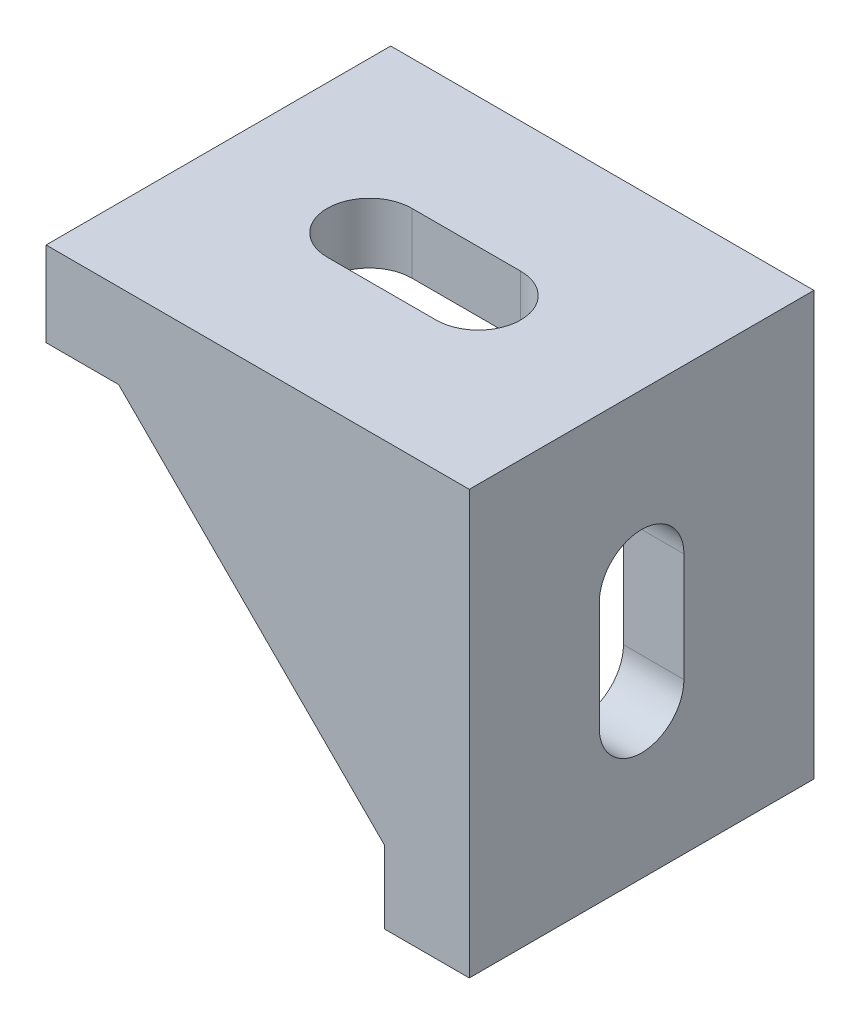
ISO-10303-21;
HEADER;
FILE_DESCRIPTION(('STEP AP214'),'2;1');
FILE_NAME('part.step','',(''),(''),'','','');
FILE_SCHEMA(('AUTOMOTIVE_DESIGN { 1 0 10303 214 1 1 1 1 }'));
ENDSEC;
DATA;
#1=APPLICATION_CONTEXT('core data for automotive mechanical design processes');
#2=APPLICATION_PROTOCOL_DEFINITION('international standard','automotive_design',2000,#1);
#3=PRODUCT_CONTEXT('',#1,'mechanical');
#4=PRODUCT('Part','Part','',(#3));
#5=PRODUCT_RELATED_PRODUCT_CATEGORY('part','',(#4));
#6=PRODUCT_DEFINITION_FORMATION('','',#4);
#7=PRODUCT_DEFINITION_CONTEXT('part definition',#1,'design');
#8=PRODUCT_DEFINITION('design','',#6,#7);
#9=PRODUCT_DEFINITION_SHAPE('','',#8);
#10=(LENGTH_UNIT() NAMED_UNIT(*) SI_UNIT(.MILLI.,.METRE.));
#11=(NAMED_UNIT(*) PLANE_ANGLE_UNIT() SI_UNIT($,.RADIAN.));
#12=(NAMED_UNIT(*) SI_UNIT($,.STERADIAN.) SOLID_ANGLE_UNIT());
#13=UNCERTAINTY_MEASURE_WITH_UNIT(LENGTH_MEASURE(1.E-05),#10,'distance_accuracy_value','');
#14=(GEOMETRIC_REPRESENTATION_CONTEXT(3) GLOBAL_UNCERTAINTY_ASSIGNED_CONTEXT((#13)) GLOBAL_UNIT_ASSIGNED_CONTEXT((#10,
#11,#12)) REPRESENTATION_CONTEXT('',''));
#15=CARTESIAN_POINT('',(0.,0.,0.));
#16=DIRECTION('',(0.,0.,1.));
#17=DIRECTION('',(1.,0.,0.));
#18=AXIS2_PLACEMENT_3D('',#15,#16,#17);
#19=CARTESIAN_POINT('',(21.8146251935267,-13.1853748064732,28.5));
#20=DIRECTION('',(0.,0.,1.));
#21=DIRECTION('',(1.,0.,0.));
#22=AXIS2_PLACEMENT_3D('',#19,#20,#21);
#23=PLANE('',#22);
#24=DIRECTION('',(-1.,0.,0.));
#25=VECTOR('',#24,1.);
#26=CARTESIAN_POINT('',(0.,0.,28.5));
#27=LINE('',#26,#25);
#28=CARTESIAN_POINT('',(35.,0.,28.5));
#29=VERTEX_POINT('',#28);
#30=CARTESIAN_POINT('',(0.,0.,28.5));
#31=VERTEX_POINT('',#30);
#32=EDGE_CURVE('E11',#29,#31,#27,.T.);
#33=ORIENTED_EDGE('',*,*,#32,.T.);
#34=DIRECTION('',(0.,-1.,0.));
#35=VECTOR('',#34,1.);
#36=CARTESIAN_POINT('',(0.,-7.,28.5));
#37=LINE('',#36,#35);
#38=CARTESIAN_POINT('',(0.,-7.,28.5));
#39=VERTEX_POINT('',#38);
#40=EDGE_CURVE('E285',#31,#39,#37,.T.);
#41=ORIENTED_EDGE('',*,*,#40,.T.);
#42=DIRECTION('',(1.,0.,0.));
#43=VECTOR('',#42,1.);
#44=CARTESIAN_POINT('',(6.,-7.,28.5));
#45=LINE('',#44,#43);
#46=CARTESIAN_POINT('',(6.,-7.,28.5));
#47=VERTEX_POINT('',#46);
#48=EDGE_CURVE('E260',#39,#47,#45,.T.);
#49=ORIENTED_EDGE('',*,*,#48,.T.);
#50=DIRECTION('',(0.707106781186547,-0.707106781186548,0.));
#51=VECTOR('',#50,1.);
#52=CARTESIAN_POINT('',(28.,-29.,28.5));
#53=LINE('',#52,#51);
#54=CARTESIAN_POINT('',(28.,-29.,28.5));
#55=VERTEX_POINT('',#54);
#56=EDGE_CURVE('E236',#47,#55,#53,.T.);
#57=ORIENTED_EDGE('',*,*,#56,.T.);
#58=DIRECTION('',(0.,-1.,0.));
#59=VECTOR('',#58,1.);
#60=CARTESIAN_POINT('',(28.,-35.,28.5));
#61=LINE('',#60,#59);
#62=CARTESIAN_POINT('',(28.,-35.,28.5));
#63=VERTEX_POINT('',#62);
#64=EDGE_CURVE('E284',#55,#63,#61,.T.);
#65=ORIENTED_EDGE('',*,*,#64,.T.);
#66=DIRECTION('',(1.,0.,0.));
#67=VECTOR('',#66,1.);
#68=CARTESIAN_POINT('',(35.,-35.,28.5));
#69=LINE('',#68,#67);
#70=CARTESIAN_POINT('',(35.,-35.,28.5));
#71=VERTEX_POINT('',#70);
#72=EDGE_CURVE('E201',#63,#71,#69,.T.);
#73=ORIENTED_EDGE('',*,*,#72,.T.);
#74=DIRECTION('',(0.,1.,0.));
#75=VECTOR('',#74,1.);
#76=CARTESIAN_POINT('',(35.,0.,28.5));
#77=LINE('',#76,#75);
#78=EDGE_CURVE('E281',#71,#29,#77,.T.);
#79=ORIENTED_EDGE('',*,*,#78,.T.);
#80=EDGE_LOOP('',(#33,#41,#49,#57,#65,#73,#79));
#81=FACE_BOUND('',#80,.T.);
#82=ADVANCED_FACE('F16',(#81),#23,.T.);
#83=CARTESIAN_POINT('',(21.8146251935267,-13.1853748064732,0.));
#84=DIRECTION('',(0.,0.,1.));
#85=DIRECTION('',(1.,0.,0.));
#86=AXIS2_PLACEMENT_3D('',#83,#84,#85);
#87=PLANE('',#86);
#88=DIRECTION('',(1.,0.,0.));
#89=VECTOR('',#88,1.);
#90=CARTESIAN_POINT('',(0.,0.,0.));
#91=LINE('',#90,#89);
#92=CARTESIAN_POINT('',(0.,0.,0.));
#93=VERTEX_POINT('',#92);
#94=CARTESIAN_POINT('',(35.,0.,0.));
#95=VERTEX_POINT('',#94);
#96=EDGE_CURVE('E26',#93,#95,#91,.T.);
#97=ORIENTED_EDGE('',*,*,#96,.T.);
#98=DIRECTION('',(0.,-1.,0.));
#99=VECTOR('',#98,1.);
#100=CARTESIAN_POINT('',(35.,0.,0.));
#101=LINE('',#100,#99);
#102=CARTESIAN_POINT('',(35.,-35.,0.));
#103=VERTEX_POINT('',#102);
#104=EDGE_CURVE('E204',#95,#103,#101,.T.);
#105=ORIENTED_EDGE('',*,*,#104,.T.);
#106=DIRECTION('',(-1.,0.,0.));
#107=VECTOR('',#106,1.);
#108=CARTESIAN_POINT('',(35.,-35.,0.));
#109=LINE('',#108,#107);
#110=CARTESIAN_POINT('',(28.,-35.,0.));
#111=VERTEX_POINT('',#110);
#112=EDGE_CURVE('E309',#103,#111,#109,.T.);
#113=ORIENTED_EDGE('',*,*,#112,.T.);
#114=DIRECTION('',(0.,1.,0.));
#115=VECTOR('',#114,1.);
#116=CARTESIAN_POINT('',(28.,-35.,0.));
#117=LINE('',#116,#115);
#118=CARTESIAN_POINT('',(28.,-29.,0.));
#119=VERTEX_POINT('',#118);
#120=EDGE_CURVE('E219',#111,#119,#117,.T.);
#121=ORIENTED_EDGE('',*,*,#120,.T.);
#122=DIRECTION('',(-0.707106781186547,0.707106781186548,0.));
#123=VECTOR('',#122,1.);
#124=CARTESIAN_POINT('',(28.,-29.,0.));
#125=LINE('',#124,#123);
#126=CARTESIAN_POINT('',(6.,-7.,0.));
#127=VERTEX_POINT('',#126);
#128=EDGE_CURVE('E158',#119,#127,#125,.T.);
#129=ORIENTED_EDGE('',*,*,#128,.T.);
#130=DIRECTION('',(-1.,0.,0.));
#131=VECTOR('',#130,1.);
#132=CARTESIAN_POINT('',(6.,-7.,0.));
#133=LINE('',#132,#131);
#134=CARTESIAN_POINT('',(0.,-7.,0.));
#135=VERTEX_POINT('',#134);
#136=EDGE_CURVE('E264',#127,#135,#133,.T.);
#137=ORIENTED_EDGE('',*,*,#136,.T.);
#138=DIRECTION('',(0.,1.,0.));
#139=VECTOR('',#138,1.);
#140=CARTESIAN_POINT('',(0.,-7.,0.));
#141=LINE('',#140,#139);
#142=EDGE_CURVE('E207',#135,#93,#141,.T.);
#143=ORIENTED_EDGE('',*,*,#142,.T.);
#144=EDGE_LOOP('',(#97,#105,#113,#121,#129,#137,#143));
#145=FACE_BOUND('',#144,.T.);
#146=ADVANCED_FACE('F326',(#145),#87,.F.);
#147=CARTESIAN_POINT('',(35.,0.,0.));
#148=DIRECTION('',(0.,1.,0.));
#149=DIRECTION('',(-1.,0.,0.));
#150=AXIS2_PLACEMENT_3D('',#147,#148,#149);
#151=PLANE('',#150);
#152=CARTESIAN_POINT('',(21.5,0.,14.25));
#153=DIRECTION('',(0.,-1.,0.));
#154=DIRECTION('',(0.,0.,-1.));
#155=AXIS2_PLACEMENT_3D('',#152,#153,#154);
#156=CIRCLE('',#155,3.5);
#157=CARTESIAN_POINT('',(21.5,0.,10.75));
#158=VERTEX_POINT('',#157);
#159=CARTESIAN_POINT('',(21.5,0.,17.75));
#160=VERTEX_POINT('',#159);
#161=EDGE_CURVE('E200',#158,#160,#156,.T.);
#162=ORIENTED_EDGE('',*,*,#161,.T.);
#163=DIRECTION('',(-1.,0.,0.));
#164=VECTOR('',#163,1.);
#165=CARTESIAN_POINT('',(23.75,0.,17.75));
#166=LINE('',#165,#164);
#167=CARTESIAN_POINT('',(12.5,0.,17.75));
#168=VERTEX_POINT('',#167);
#169=EDGE_CURVE('E245',#160,#168,#166,.T.);
#170=ORIENTED_EDGE('',*,*,#169,.T.);
#171=CARTESIAN_POINT('',(12.5,0.,14.25));
#172=DIRECTION('',(0.,-1.,0.));
#173=DIRECTION('',(0.,0.,1.));
#174=AXIS2_PLACEMENT_3D('',#171,#172,#173);
#175=CIRCLE('',#174,3.5);
#176=CARTESIAN_POINT('',(12.5,0.,10.75));
#177=VERTEX_POINT('',#176);
#178=EDGE_CURVE('E289',#168,#177,#175,.T.);
#179=ORIENTED_EDGE('',*,*,#178,.T.);
#180=DIRECTION('',(1.,0.,0.));
#181=VECTOR('',#180,1.);
#182=CARTESIAN_POINT('',(28.25,0.,10.75));
#183=LINE('',#182,#181);
#184=EDGE_CURVE('E194',#177,#158,#183,.T.);
#185=ORIENTED_EDGE('',*,*,#184,.T.);
#186=EDGE_LOOP('',(#162,#170,#179,#185));
#187=FACE_BOUND('',#186,.T.);
#188=ORIENTED_EDGE('',*,*,#96,.F.);
#189=DIRECTION('',(0.,0.,1.));
#190=VECTOR('',#189,1.);
#191=CARTESIAN_POINT('',(0.,0.,0.));
#192=LINE('',#191,#190);
#193=EDGE_CURVE('E221',#93,#31,#192,.T.);
#194=ORIENTED_EDGE('',*,*,#193,.T.);
#195=ORIENTED_EDGE('',*,*,#32,.F.);
#196=DIRECTION('',(0.,0.,1.));
#197=VECTOR('',#196,1.);
#198=CARTESIAN_POINT('',(35.,0.,0.));
#199=LINE('',#198,#197);
#200=EDGE_CURVE('E278',#95,#29,#199,.T.);
#201=ORIENTED_EDGE('',*,*,#200,.F.);
#202=EDGE_LOOP('',(#188,#194,#195,#201));
#203=FACE_BOUND('',#202,.T.);
#204=ADVANCED_FACE('F374',(#187,#203),#151,.T.);
#205=CARTESIAN_POINT('',(0.,0.,0.));
#206=DIRECTION('',(-1.,0.,0.));
#207=DIRECTION('',(0.,-1.,0.));
#208=AXIS2_PLACEMENT_3D('',#205,#206,#207);
#209=PLANE('',#208);
#210=DIRECTION('',(0.,-1.,0.));
#211=VECTOR('',#210,1.);
#212=CARTESIAN_POINT('',(0.,-17.5,25.5));
#213=LINE('',#212,#211);
#214=CARTESIAN_POINT('',(0.,-5.,25.5));
#215=VERTEX_POINT('',#214);
#216=CARTESIAN_POINT('',(0.,-7.,25.5));
#217=VERTEX_POINT('',#216);
#218=EDGE_CURVE('E240',#215,#217,#213,.T.);
#219=ORIENTED_EDGE('',*,*,#218,.T.);
#220=DIRECTION('',(0.,0.,1.));
#221=VECTOR('',#220,1.);
#222=CARTESIAN_POINT('',(0.,-7.,0.));
#223=LINE('',#222,#221);
#224=EDGE_CURVE('E269',#217,#39,#223,.T.);
#225=ORIENTED_EDGE('',*,*,#224,.T.);
#226=ORIENTED_EDGE('',*,*,#40,.F.);
#227=ORIENTED_EDGE('',*,*,#193,.F.);
#228=ORIENTED_EDGE('',*,*,#142,.F.);
#229=DIRECTION('',(0.,0.,1.));
#230=VECTOR('',#229,1.);
#231=CARTESIAN_POINT('',(0.,-7.,0.));
#232=LINE('',#231,#230);
#233=CARTESIAN_POINT('',(0.,-7.,3.));
#234=VERTEX_POINT('',#233);
#235=EDGE_CURVE('E247',#135,#234,#232,.T.);
#236=ORIENTED_EDGE('',*,*,#235,.T.);
#237=DIRECTION('',(0.,1.,0.));
#238=VECTOR('',#237,1.);
#239=CARTESIAN_POINT('',(0.,-17.5,3.));
#240=LINE('',#239,#238);
#241=CARTESIAN_POINT('',(0.,-5.,3.));
#242=VERTEX_POINT('',#241);
#243=EDGE_CURVE('E300',#234,#242,#240,.T.);
#244=ORIENTED_EDGE('',*,*,#243,.T.);
#245=DIRECTION('',(0.,0.,1.));
#246=VECTOR('',#245,1.);
#247=CARTESIAN_POINT('',(0.,-5.,7.125));
#248=LINE('',#247,#246);
#249=EDGE_CURVE('E136',#242,#215,#248,.T.);
#250=ORIENTED_EDGE('',*,*,#249,.T.);
#251=EDGE_LOOP('',(#219,#225,#226,#227,#228,#236,#244,#250));
#252=FACE_BOUND('',#251,.T.);
#253=ADVANCED_FACE('F337',(#252),#209,.T.);
#254=CARTESIAN_POINT('',(35.,-35.,0.));
#255=DIRECTION('',(1.,0.,0.));
#256=DIRECTION('',(0.,1.,0.));
#257=AXIS2_PLACEMENT_3D('',#254,#255,#256);
#258=PLANE('',#257);
#259=CARTESIAN_POINT('',(35.,-13.5,14.25));
#260=DIRECTION('',(-1.,0.,0.));
#261=DIRECTION('',(0.,0.,-1.));
#262=AXIS2_PLACEMENT_3D('',#259,#260,#261);
#263=CIRCLE('',#262,3.5);
#264=CARTESIAN_POINT('',(35.,-13.5,17.75));
#265=VERTEX_POINT('',#264);
#266=CARTESIAN_POINT('',(35.,-13.5,10.75));
#267=VERTEX_POINT('',#266);
#268=EDGE_CURVE('E181',#265,#267,#263,.T.);
#269=ORIENTED_EDGE('',*,*,#268,.T.);
#270=DIRECTION('',(0.,-1.,0.));
#271=VECTOR('',#270,1.);
#272=CARTESIAN_POINT('',(35.,-28.75,10.75));
#273=LINE('',#272,#271);
#274=CARTESIAN_POINT('',(35.,-22.5,10.75));
#275=VERTEX_POINT('',#274);
#276=EDGE_CURVE('E227',#267,#275,#273,.T.);
#277=ORIENTED_EDGE('',*,*,#276,.T.);
#278=CARTESIAN_POINT('',(35.,-22.5,14.25));
#279=DIRECTION('',(-1.,0.,0.));
#280=DIRECTION('',(0.,0.,1.));
#281=AXIS2_PLACEMENT_3D('',#278,#279,#280);
#282=CIRCLE('',#281,3.5);
#283=CARTESIAN_POINT('',(35.,-22.5,17.75));
#284=VERTEX_POINT('',#283);
#285=EDGE_CURVE('E214',#275,#284,#282,.T.);
#286=ORIENTED_EDGE('',*,*,#285,.T.);
#287=DIRECTION('',(0.,1.,0.));
#288=VECTOR('',#287,1.);
#289=CARTESIAN_POINT('',(35.,-24.25,17.75));
#290=LINE('',#289,#288);
#291=EDGE_CURVE('E211',#284,#265,#290,.T.);
#292=ORIENTED_EDGE('',*,*,#291,.T.);
#293=EDGE_LOOP('',(#269,#277,#286,#292));
#294=FACE_BOUND('',#293,.T.);
#295=ORIENTED_EDGE('',*,*,#104,.F.);
#296=ORIENTED_EDGE('',*,*,#200,.T.);
#297=ORIENTED_EDGE('',*,*,#78,.F.);
#298=DIRECTION('',(0.,0.,1.));
#299=VECTOR('',#298,1.);
#300=CARTESIAN_POINT('',(35.,-35.,0.));
#301=LINE('',#300,#299);
#302=EDGE_CURVE('E205',#103,#71,#301,.T.);
#303=ORIENTED_EDGE('',*,*,#302,.F.);
#304=EDGE_LOOP('',(#295,#296,#297,#303));
#305=FACE_BOUND('',#304,.T.);
#306=ADVANCED_FACE('F373',(#294,#305),#258,.T.);
#307=CARTESIAN_POINT('',(28.,-35.,0.));
#308=DIRECTION('',(0.,-1.,0.));
#309=DIRECTION('',(1.,0.,0.));
#310=AXIS2_PLACEMENT_3D('',#307,#308,#309);
#311=PLANE('',#310);
#312=DIRECTION('',(1.,0.,0.));
#313=VECTOR('',#312,1.);
#314=CARTESIAN_POINT('',(14.,-35.,25.5));
#315=LINE('',#314,#313);
#316=CARTESIAN_POINT('',(28.,-35.,25.5));
#317=VERTEX_POINT('',#316);
#318=CARTESIAN_POINT('',(30.,-35.,25.5));
#319=VERTEX_POINT('',#318);
#320=EDGE_CURVE('E253',#317,#319,#315,.T.);
#321=ORIENTED_EDGE('',*,*,#320,.T.);
#322=DIRECTION('',(0.,0.,-1.));
#323=VECTOR('',#322,1.);
#324=CARTESIAN_POINT('',(30.,-35.,12.75));
#325=LINE('',#324,#323);
#326=CARTESIAN_POINT('',(30.,-35.,3.));
#327=VERTEX_POINT('',#326);
#328=EDGE_CURVE('E297',#319,#327,#325,.T.);
#329=ORIENTED_EDGE('',*,*,#328,.T.);
#330=DIRECTION('',(-1.,0.,0.));
#331=VECTOR('',#330,1.);
#332=CARTESIAN_POINT('',(29.,-35.,3.));
#333=LINE('',#332,#331);
#334=CARTESIAN_POINT('',(28.,-35.,3.));
#335=VERTEX_POINT('',#334);
#336=EDGE_CURVE('E171',#327,#335,#333,.T.);
#337=ORIENTED_EDGE('',*,*,#336,.T.);
#338=DIRECTION('',(0.,0.,1.));
#339=VECTOR('',#338,1.);
#340=CARTESIAN_POINT('',(28.,-35.,0.));
#341=LINE('',#340,#339);
#342=EDGE_CURVE('E167',#111,#335,#341,.T.);
#343=ORIENTED_EDGE('',*,*,#342,.F.);
#344=ORIENTED_EDGE('',*,*,#112,.F.);
#345=ORIENTED_EDGE('',*,*,#302,.T.);
#346=ORIENTED_EDGE('',*,*,#72,.F.);
#347=DIRECTION('',(0.,0.,1.));
#348=VECTOR('',#347,1.);
#349=CARTESIAN_POINT('',(28.,-35.,0.));
#350=LINE('',#349,#348);
#351=EDGE_CURVE('E218',#317,#63,#350,.T.);
#352=ORIENTED_EDGE('',*,*,#351,.F.);
#353=EDGE_LOOP('',(#321,#329,#337,#343,#344,#345,#346,#352));
#354=FACE_BOUND('',#353,.T.);
#355=ADVANCED_FACE('F330',(#354),#311,.T.);
#356=CARTESIAN_POINT('',(28.,-29.,0.));
#357=DIRECTION('',(-1.,0.,0.));
#358=DIRECTION('',(0.,-1.,0.));
#359=AXIS2_PLACEMENT_3D('',#356,#357,#358);
#360=PLANE('',#359);
#361=DIRECTION('',(0.,-1.,0.));
#362=VECTOR('',#361,1.);
#363=CARTESIAN_POINT('',(28.,-32.,25.5));
#364=LINE('',#363,#362);
#365=CARTESIAN_POINT('',(28.,-29.,25.5));
#366=VERTEX_POINT('',#365);
#367=EDGE_CURVE('E250',#366,#317,#364,.T.);
#368=ORIENTED_EDGE('',*,*,#367,.T.);
#369=ORIENTED_EDGE('',*,*,#351,.T.);
#370=ORIENTED_EDGE('',*,*,#64,.F.);
#371=DIRECTION('',(0.,0.,1.));
#372=VECTOR('',#371,1.);
#373=CARTESIAN_POINT('',(28.,-29.,0.));
#374=LINE('',#373,#372);
#375=EDGE_CURVE('E161',#366,#55,#374,.T.);
#376=ORIENTED_EDGE('',*,*,#375,.F.);
#377=EDGE_LOOP('',(#368,#369,#370,#376));
#378=FACE_BOUND('',#377,.T.);
#379=ADVANCED_FACE('F368',(#378),#360,.T.);
#380=CARTESIAN_POINT('',(28.,-29.,0.));
#381=DIRECTION('',(-1.,0.,0.));
#382=DIRECTION('',(0.,-1.,0.));
#383=AXIS2_PLACEMENT_3D('',#380,#381,#382);
#384=PLANE('',#383);
#385=DIRECTION('',(0.,1.,0.));
#386=VECTOR('',#385,1.);
#387=CARTESIAN_POINT('',(28.,-32.,3.));
#388=LINE('',#387,#386);
#389=CARTESIAN_POINT('',(28.,-29.,3.));
#390=VERTEX_POINT('',#389);
#391=EDGE_CURVE('E164',#335,#390,#388,.T.);
#392=ORIENTED_EDGE('',*,*,#391,.T.);
#393=DIRECTION('',(0.,0.,1.));
#394=VECTOR('',#393,1.);
#395=CARTESIAN_POINT('',(28.,-29.,0.));
#396=LINE('',#395,#394);
#397=EDGE_CURVE('E151',#119,#390,#396,.T.);
#398=ORIENTED_EDGE('',*,*,#397,.F.);
#399=ORIENTED_EDGE('',*,*,#120,.F.);
#400=ORIENTED_EDGE('',*,*,#342,.T.);
#401=EDGE_LOOP('',(#392,#398,#399,#400));
#402=FACE_BOUND('',#401,.T.);
#403=ADVANCED_FACE('F165',(#402),#384,.T.);
#404=CARTESIAN_POINT('',(6.,-7.,0.));
#405=DIRECTION('',(-0.707106781186548,-0.707106781186547,0.));
#406=DIRECTION('',(0.707106781186547,-0.707106781186548,0.));
#407=AXIS2_PLACEMENT_3D('',#404,#405,#406);
#408=PLANE('',#407);
#409=DIRECTION('',(0.707106781186547,-0.707106781186548,0.));
#410=VECTOR('',#409,1.);
#411=CARTESIAN_POINT('',(11.5,-12.5,25.5));
#412=LINE('',#411,#410);
#413=CARTESIAN_POINT('',(6.,-7.,25.5));
#414=VERTEX_POINT('',#413);
#415=EDGE_CURVE('E177',#414,#366,#412,.T.);
#416=ORIENTED_EDGE('',*,*,#415,.T.);
#417=ORIENTED_EDGE('',*,*,#375,.T.);
#418=ORIENTED_EDGE('',*,*,#56,.F.);
#419=DIRECTION('',(0.,0.,1.));
#420=VECTOR('',#419,1.);
#421=CARTESIAN_POINT('',(6.,-7.,0.));
#422=LINE('',#421,#420);
#423=EDGE_CURVE('E257',#414,#47,#422,.T.);
#424=ORIENTED_EDGE('',*,*,#423,.F.);
#425=EDGE_LOOP('',(#416,#417,#418,#424));
#426=FACE_BOUND('',#425,.T.);
#427=ADVANCED_FACE('F355',(#426),#408,.T.);
#428=CARTESIAN_POINT('',(6.,-7.,0.));
#429=DIRECTION('',(-0.707106781186548,-0.707106781186547,0.));
#430=DIRECTION('',(0.707106781186547,-0.707106781186548,0.));
#431=AXIS2_PLACEMENT_3D('',#428,#429,#430);
#432=PLANE('',#431);
#433=DIRECTION('',(-0.707106781186547,0.707106781186548,0.));
#434=VECTOR('',#433,1.);
#435=CARTESIAN_POINT('',(19.,-20.,3.));
#436=LINE('',#435,#434);
#437=CARTESIAN_POINT('',(6.,-7.,3.));
#438=VERTEX_POINT('',#437);
#439=EDGE_CURVE('E156',#390,#438,#436,.T.);
#440=ORIENTED_EDGE('',*,*,#439,.T.);
#441=DIRECTION('',(0.,0.,1.));
#442=VECTOR('',#441,1.);
#443=CARTESIAN_POINT('',(6.,-7.,0.));
#444=LINE('',#443,#442);
#445=EDGE_CURVE('E261',#127,#438,#444,.T.);
#446=ORIENTED_EDGE('',*,*,#445,.F.);
#447=ORIENTED_EDGE('',*,*,#128,.F.);
#448=ORIENTED_EDGE('',*,*,#397,.T.);
#449=EDGE_LOOP('',(#440,#446,#447,#448));
#450=FACE_BOUND('',#449,.T.);
#451=ADVANCED_FACE('F153',(#450),#432,.T.);
#452=CARTESIAN_POINT('',(0.,-7.,0.));
#453=DIRECTION('',(0.,-1.,0.));
#454=DIRECTION('',(1.,0.,0.));
#455=AXIS2_PLACEMENT_3D('',#452,#453,#454);
#456=PLANE('',#455);
#457=DIRECTION('',(1.,0.,0.));
#458=VECTOR('',#457,1.);
#459=CARTESIAN_POINT('',(0.,-7.,25.5));
#460=LINE('',#459,#458);
#461=EDGE_CURVE('E237',#217,#414,#460,.T.);
#462=ORIENTED_EDGE('',*,*,#461,.T.);
#463=ORIENTED_EDGE('',*,*,#423,.T.);
#464=ORIENTED_EDGE('',*,*,#48,.F.);
#465=ORIENTED_EDGE('',*,*,#224,.F.);
#466=EDGE_LOOP('',(#462,#463,#464,#465));
#467=FACE_BOUND('',#466,.T.);
#468=ADVANCED_FACE('F361',(#467),#456,.T.);
#469=CARTESIAN_POINT('',(0.,-7.,0.));
#470=DIRECTION('',(0.,-1.,0.));
#471=DIRECTION('',(1.,0.,0.));
#472=AXIS2_PLACEMENT_3D('',#469,#470,#471);
#473=PLANE('',#472);
#474=DIRECTION('',(-1.,0.,0.));
#475=VECTOR('',#474,1.);
#476=CARTESIAN_POINT('',(15.,-7.,3.));
#477=LINE('',#476,#475);
#478=EDGE_CURVE('E20',#438,#234,#477,.T.);
#479=ORIENTED_EDGE('',*,*,#478,.T.);
#480=ORIENTED_EDGE('',*,*,#235,.F.);
#481=ORIENTED_EDGE('',*,*,#136,.F.);
#482=ORIENTED_EDGE('',*,*,#445,.T.);
#483=EDGE_LOOP('',(#479,#480,#481,#482));
#484=FACE_BOUND('',#483,.T.);
#485=ADVANCED_FACE('F340',(#484),#473,.T.);
#486=CARTESIAN_POINT('',(15.,-5.,14.25));
#487=DIRECTION('',(0.,1.,0.));
#488=DIRECTION('',(0.,0.,1.));
#489=AXIS2_PLACEMENT_3D('',#486,#487,#488);
#490=PLANE('',#489);
#491=CARTESIAN_POINT('',(21.5,-5.,14.25));
#492=DIRECTION('',(0.,1.,0.));
#493=DIRECTION('',(0.,0.,-1.));
#494=AXIS2_PLACEMENT_3D('',#491,#492,#493);
#495=CIRCLE('',#494,3.5);
#496=CARTESIAN_POINT('',(21.5,-5.,17.75));
#497=VERTEX_POINT('',#496);
#498=CARTESIAN_POINT('',(21.5,-5.,10.75));
#499=VERTEX_POINT('',#498);
#500=EDGE_CURVE('E196',#497,#499,#495,.T.);
#501=ORIENTED_EDGE('',*,*,#500,.T.);
#502=DIRECTION('',(-1.,0.,0.));
#503=VECTOR('',#502,1.);
#504=CARTESIAN_POINT('',(18.25,-5.,10.75));
#505=LINE('',#504,#503);
#506=CARTESIAN_POINT('',(12.5,-5.,10.75));
#507=VERTEX_POINT('',#506);
#508=EDGE_CURVE('E224',#499,#507,#505,.T.);
#509=ORIENTED_EDGE('',*,*,#508,.T.);
#510=CARTESIAN_POINT('',(12.5,-5.,14.25));
#511=DIRECTION('',(0.,1.,0.));
#512=DIRECTION('',(0.,0.,1.));
#513=AXIS2_PLACEMENT_3D('',#510,#511,#512);
#514=CIRCLE('',#513,3.5);
#515=CARTESIAN_POINT('',(12.5,-5.,17.75));
#516=VERTEX_POINT('',#515);
#517=EDGE_CURVE('E195',#507,#516,#514,.T.);
#518=ORIENTED_EDGE('',*,*,#517,.T.);
#519=DIRECTION('',(1.,0.,0.));
#520=VECTOR('',#519,1.);
#521=CARTESIAN_POINT('',(13.75,-5.,17.75));
#522=LINE('',#521,#520);
#523=EDGE_CURVE('E241',#516,#497,#522,.T.);
#524=ORIENTED_EDGE('',*,*,#523,.T.);
#525=EDGE_LOOP('',(#501,#509,#518,#524));
#526=FACE_BOUND('',#525,.T.);
#527=DIRECTION('',(1.,0.,0.));
#528=VECTOR('',#527,1.);
#529=CARTESIAN_POINT('',(0.,-5.,25.5));
#530=LINE('',#529,#528);
#531=CARTESIAN_POINT('',(30.,-5.,25.5));
#532=VERTEX_POINT('',#531);
#533=EDGE_CURVE('E243',#215,#532,#530,.T.);
#534=ORIENTED_EDGE('',*,*,#533,.F.);
#535=ORIENTED_EDGE('',*,*,#249,.F.);
#536=DIRECTION('',(-1.,0.,0.));
#537=VECTOR('',#536,1.);
#538=CARTESIAN_POINT('',(30.,-5.,3.));
#539=LINE('',#538,#537);
#540=CARTESIAN_POINT('',(30.,-5.,3.));
#541=VERTEX_POINT('',#540);
#542=EDGE_CURVE('E234',#541,#242,#539,.T.);
#543=ORIENTED_EDGE('',*,*,#542,.F.);
#544=DIRECTION('',(0.,0.,-1.));
#545=VECTOR('',#544,1.);
#546=CARTESIAN_POINT('',(30.,-5.,25.5));
#547=LINE('',#546,#545);
#548=EDGE_CURVE('E142',#532,#541,#547,.T.);
#549=ORIENTED_EDGE('',*,*,#548,.F.);
#550=EDGE_LOOP('',(#534,#535,#543,#549));
#551=FACE_BOUND('',#550,.T.);
#552=ADVANCED_FACE('F335',(#526,#551),#490,.F.);
#553=CARTESIAN_POINT('',(30.,-35.,25.5));
#554=DIRECTION('',(1.,0.,0.));
#555=DIRECTION('',(0.,0.,-1.));
#556=AXIS2_PLACEMENT_3D('',#553,#554,#555);
#557=PLANE('',#556);
#558=CARTESIAN_POINT('',(30.,-13.5,14.25));
#559=DIRECTION('',(1.,0.,0.));
#560=DIRECTION('',(0.,0.,-1.));
#561=AXIS2_PLACEMENT_3D('',#558,#559,#560);
#562=CIRCLE('',#561,3.5);
#563=CARTESIAN_POINT('',(30.,-13.5,10.75));
#564=VERTEX_POINT('',#563);
#565=CARTESIAN_POINT('',(30.,-13.5,17.75));
#566=VERTEX_POINT('',#565);
#567=EDGE_CURVE('E184',#564,#566,#562,.T.);
#568=ORIENTED_EDGE('',*,*,#567,.T.);
#569=DIRECTION('',(0.,-1.,0.));
#570=VECTOR('',#569,1.);
#571=CARTESIAN_POINT('',(30.,-24.25,17.75));
#572=LINE('',#571,#570);
#573=CARTESIAN_POINT('',(30.,-22.5,17.75));
#574=VERTEX_POINT('',#573);
#575=EDGE_CURVE('E208',#566,#574,#572,.T.);
#576=ORIENTED_EDGE('',*,*,#575,.T.);
#577=CARTESIAN_POINT('',(30.,-22.5,14.25));
#578=DIRECTION('',(1.,0.,0.));
#579=DIRECTION('',(0.,0.,1.));
#580=AXIS2_PLACEMENT_3D('',#577,#578,#579);
#581=CIRCLE('',#580,3.5);
#582=CARTESIAN_POINT('',(30.,-22.5,10.75));
#583=VERTEX_POINT('',#582);
#584=EDGE_CURVE('E186',#574,#583,#581,.T.);
#585=ORIENTED_EDGE('',*,*,#584,.T.);
#586=DIRECTION('',(0.,1.,0.));
#587=VECTOR('',#586,1.);
#588=CARTESIAN_POINT('',(30.,-28.75,10.75));
#589=LINE('',#588,#587);
#590=EDGE_CURVE('E230',#583,#564,#589,.T.);
#591=ORIENTED_EDGE('',*,*,#590,.T.);
#592=EDGE_LOOP('',(#568,#576,#585,#591));
#593=FACE_BOUND('',#592,.T.);
#594=ORIENTED_EDGE('',*,*,#328,.F.);
#595=DIRECTION('',(0.,1.,0.));
#596=VECTOR('',#595,1.);
#597=CARTESIAN_POINT('',(30.,-35.,25.5));
#598=LINE('',#597,#596);
#599=EDGE_CURVE('E256',#319,#532,#598,.T.);
#600=ORIENTED_EDGE('',*,*,#599,.T.);
#601=ORIENTED_EDGE('',*,*,#548,.T.);
#602=DIRECTION('',(0.,1.,0.));
#603=VECTOR('',#602,1.);
#604=CARTESIAN_POINT('',(30.,-35.,3.));
#605=LINE('',#604,#603);
#606=EDGE_CURVE('E231',#327,#541,#605,.T.);
#607=ORIENTED_EDGE('',*,*,#606,.F.);
#608=EDGE_LOOP('',(#594,#600,#601,#607));
#609=FACE_BOUND('',#608,.T.);
#610=ADVANCED_FACE('F333',(#593,#609),#557,.F.);
#611=CARTESIAN_POINT('',(30.,-35.,3.));
#612=DIRECTION('',(0.,0.,-1.));
#613=DIRECTION('',(-1.,0.,0.));
#614=AXIS2_PLACEMENT_3D('',#611,#612,#613);
#615=PLANE('',#614);
#616=ORIENTED_EDGE('',*,*,#478,.F.);
#617=ORIENTED_EDGE('',*,*,#439,.F.);
#618=ORIENTED_EDGE('',*,*,#391,.F.);
#619=ORIENTED_EDGE('',*,*,#336,.F.);
#620=ORIENTED_EDGE('',*,*,#606,.T.);
#621=ORIENTED_EDGE('',*,*,#542,.T.);
#622=ORIENTED_EDGE('',*,*,#243,.F.);
#623=EDGE_LOOP('',(#616,#617,#618,#619,#620,#621,#622));
#624=FACE_BOUND('',#623,.T.);
#625=ADVANCED_FACE('F173',(#624),#615,.F.);
#626=CARTESIAN_POINT('',(0.,-35.,25.5));
#627=DIRECTION('',(0.,0.,1.));
#628=DIRECTION('',(1.,0.,0.));
#629=AXIS2_PLACEMENT_3D('',#626,#627,#628);
#630=PLANE('',#629);
#631=ORIENTED_EDGE('',*,*,#461,.F.);
#632=ORIENTED_EDGE('',*,*,#218,.F.);
#633=ORIENTED_EDGE('',*,*,#533,.T.);
#634=ORIENTED_EDGE('',*,*,#599,.F.);
#635=ORIENTED_EDGE('',*,*,#320,.F.);
#636=ORIENTED_EDGE('',*,*,#367,.F.);
#637=ORIENTED_EDGE('',*,*,#415,.F.);
#638=EDGE_LOOP('',(#631,#632,#633,#634,#635,#636,#637));
#639=FACE_BOUND('',#638,.T.);
#640=ADVANCED_FACE('F364',(#639),#630,.F.);
#641=CARTESIAN_POINT('',(12.5,-5.,17.75));
#642=DIRECTION('',(0.,0.,1.));
#643=DIRECTION('',(1.,0.,0.));
#644=AXIS2_PLACEMENT_3D('',#641,#642,#643);
#645=PLANE('',#644);
#646=ORIENTED_EDGE('',*,*,#169,.F.);
#647=DIRECTION('',(0.,1.,0.));
#648=VECTOR('',#647,1.);
#649=CARTESIAN_POINT('',(21.5,-5.,17.75));
#650=LINE('',#649,#648);
#651=EDGE_CURVE('E199',#497,#160,#650,.T.);
#652=ORIENTED_EDGE('',*,*,#651,.F.);
#653=ORIENTED_EDGE('',*,*,#523,.F.);
#654=DIRECTION('',(0.,1.,0.));
#655=VECTOR('',#654,1.);
#656=CARTESIAN_POINT('',(12.5,-5.,17.75));
#657=LINE('',#656,#655);
#658=EDGE_CURVE('E304',#516,#168,#657,.T.);
#659=ORIENTED_EDGE('',*,*,#658,.T.);
#660=EDGE_LOOP('',(#646,#652,#653,#659));
#661=FACE_BOUND('',#660,.T.);
#662=ADVANCED_FACE('F386',(#661),#645,.F.);
#663=CARTESIAN_POINT('',(21.5,-5.,14.25));
#664=DIRECTION('',(0.,-1.,0.));
#665=DIRECTION('',(0.,0.,-1.));
#666=AXIS2_PLACEMENT_3D('',#663,#664,#665);
#667=CYLINDRICAL_SURFACE('',#666,3.5);
#668=ORIENTED_EDGE('',*,*,#161,.F.);
#669=DIRECTION('',(0.,1.,0.));
#670=VECTOR('',#669,1.);
#671=CARTESIAN_POINT('',(21.5,-5.,10.75));
#672=LINE('',#671,#670);
#673=EDGE_CURVE('E226',#499,#158,#672,.T.);
#674=ORIENTED_EDGE('',*,*,#673,.F.);
#675=ORIENTED_EDGE('',*,*,#500,.F.);
#676=ORIENTED_EDGE('',*,*,#651,.T.);
#677=EDGE_LOOP('',(#668,#674,#675,#676));
#678=FACE_BOUND('',#677,.T.);
#679=ADVANCED_FACE('F397',(#678),#667,.F.);
#680=CARTESIAN_POINT('',(21.5,-5.,10.75));
#681=DIRECTION('',(0.,0.,-1.));
#682=DIRECTION('',(-1.,0.,0.));
#683=AXIS2_PLACEMENT_3D('',#680,#681,#682);
#684=PLANE('',#683);
#685=ORIENTED_EDGE('',*,*,#184,.F.);
#686=DIRECTION('',(0.,1.,0.));
#687=VECTOR('',#686,1.);
#688=CARTESIAN_POINT('',(12.5,-5.,10.75));
#689=LINE('',#688,#687);
#690=EDGE_CURVE('E191',#507,#177,#689,.T.);
#691=ORIENTED_EDGE('',*,*,#690,.F.);
#692=ORIENTED_EDGE('',*,*,#508,.F.);
#693=ORIENTED_EDGE('',*,*,#673,.T.);
#694=EDGE_LOOP('',(#685,#691,#692,#693));
#695=FACE_BOUND('',#694,.T.);
#696=ADVANCED_FACE('F393',(#695),#684,.F.);
#697=CARTESIAN_POINT('',(12.5,-5.,14.25));
#698=DIRECTION('',(0.,-1.,0.));
#699=DIRECTION('',(0.,0.,1.));
#700=AXIS2_PLACEMENT_3D('',#697,#698,#699);
#701=CYLINDRICAL_SURFACE('',#700,3.5);
#702=ORIENTED_EDGE('',*,*,#178,.F.);
#703=ORIENTED_EDGE('',*,*,#658,.F.);
#704=ORIENTED_EDGE('',*,*,#517,.F.);
#705=ORIENTED_EDGE('',*,*,#690,.T.);
#706=EDGE_LOOP('',(#702,#703,#704,#705));
#707=FACE_BOUND('',#706,.T.);
#708=ADVANCED_FACE('F389',(#707),#701,.F.);
#709=CARTESIAN_POINT('',(30.,-22.5,10.75));
#710=DIRECTION('',(0.,0.,-1.));
#711=DIRECTION('',(0.,1.,0.));
#712=AXIS2_PLACEMENT_3D('',#709,#710,#711);
#713=PLANE('',#712);
#714=ORIENTED_EDGE('',*,*,#276,.F.);
#715=DIRECTION('',(1.,0.,0.));
#716=VECTOR('',#715,1.);
#717=CARTESIAN_POINT('',(30.,-13.5,10.75));
#718=LINE('',#717,#716);
#719=EDGE_CURVE('E223',#564,#267,#718,.T.);
#720=ORIENTED_EDGE('',*,*,#719,.F.);
#721=ORIENTED_EDGE('',*,*,#590,.F.);
#722=DIRECTION('',(1.,0.,0.));
#723=VECTOR('',#722,1.);
#724=CARTESIAN_POINT('',(30.,-22.5,10.75));
#725=LINE('',#724,#723);
#726=EDGE_CURVE('E190',#583,#275,#725,.T.);
#727=ORIENTED_EDGE('',*,*,#726,.T.);
#728=EDGE_LOOP('',(#714,#720,#721,#727));
#729=FACE_BOUND('',#728,.T.);
#730=ADVANCED_FACE('F405',(#729),#713,.F.);
#731=CARTESIAN_POINT('',(30.,-13.5,14.25));
#732=DIRECTION('',(-1.,0.,0.));
#733=DIRECTION('',(0.,0.,-1.));
#734=AXIS2_PLACEMENT_3D('',#731,#732,#733);
#735=CYLINDRICAL_SURFACE('',#734,3.5);
#736=ORIENTED_EDGE('',*,*,#268,.F.);
#737=DIRECTION('',(1.,0.,0.));
#738=VECTOR('',#737,1.);
#739=CARTESIAN_POINT('',(30.,-13.5,17.75));
#740=LINE('',#739,#738);
#741=EDGE_CURVE('E185',#566,#265,#740,.T.);
#742=ORIENTED_EDGE('',*,*,#741,.F.);
#743=ORIENTED_EDGE('',*,*,#567,.F.);
#744=ORIENTED_EDGE('',*,*,#719,.T.);
#745=EDGE_LOOP('',(#736,#742,#743,#744));
#746=FACE_BOUND('',#745,.T.);
#747=ADVANCED_FACE('F411',(#746),#735,.F.);
#748=CARTESIAN_POINT('',(30.,-13.5,17.75));
#749=DIRECTION('',(0.,0.,1.));
#750=DIRECTION('',(0.,-1.,0.));
#751=AXIS2_PLACEMENT_3D('',#748,#749,#750);
#752=PLANE('',#751);
#753=ORIENTED_EDGE('',*,*,#291,.F.);
#754=DIRECTION('',(1.,0.,0.));
#755=VECTOR('',#754,1.);
#756=CARTESIAN_POINT('',(30.,-22.5,17.75));
#757=LINE('',#756,#755);
#758=EDGE_CURVE('E189',#574,#284,#757,.T.);
#759=ORIENTED_EDGE('',*,*,#758,.F.);
#760=ORIENTED_EDGE('',*,*,#575,.F.);
#761=ORIENTED_EDGE('',*,*,#741,.T.);
#762=EDGE_LOOP('',(#753,#759,#760,#761));
#763=FACE_BOUND('',#762,.T.);
#764=ADVANCED_FACE('F18',(#763),#752,.F.);
#765=CARTESIAN_POINT('',(30.,-22.5,14.25));
#766=DIRECTION('',(-1.,0.,0.));
#767=DIRECTION('',(0.,0.,1.));
#768=AXIS2_PLACEMENT_3D('',#765,#766,#767);
#769=CYLINDRICAL_SURFACE('',#768,3.5);
#770=ORIENTED_EDGE('',*,*,#285,.F.);
#771=ORIENTED_EDGE('',*,*,#726,.F.);
#772=ORIENTED_EDGE('',*,*,#584,.F.);
#773=ORIENTED_EDGE('',*,*,#758,.T.);
#774=EDGE_LOOP('',(#770,#771,#772,#773));
#775=FACE_BOUND('',#774,.T.);
#776=ADVANCED_FACE('F418',(#775),#769,.F.);
#777=CLOSED_SHELL('',(#82,#146,#204,#253,#306,#355,#379,#403,#427,#451,#468,#485,#552,#610,#625,
#640,#662,#679,#696,#708,#730,#747,#764,#776));
#778=MANIFOLD_SOLID_BREP('B1',#777);
#779=ADVANCED_BREP_SHAPE_REPRESENTATION('',(#18,#778),#14);
#780=SHAPE_DEFINITION_REPRESENTATION(#9,#779);
ENDSEC;
END-ISO-10303-21;
